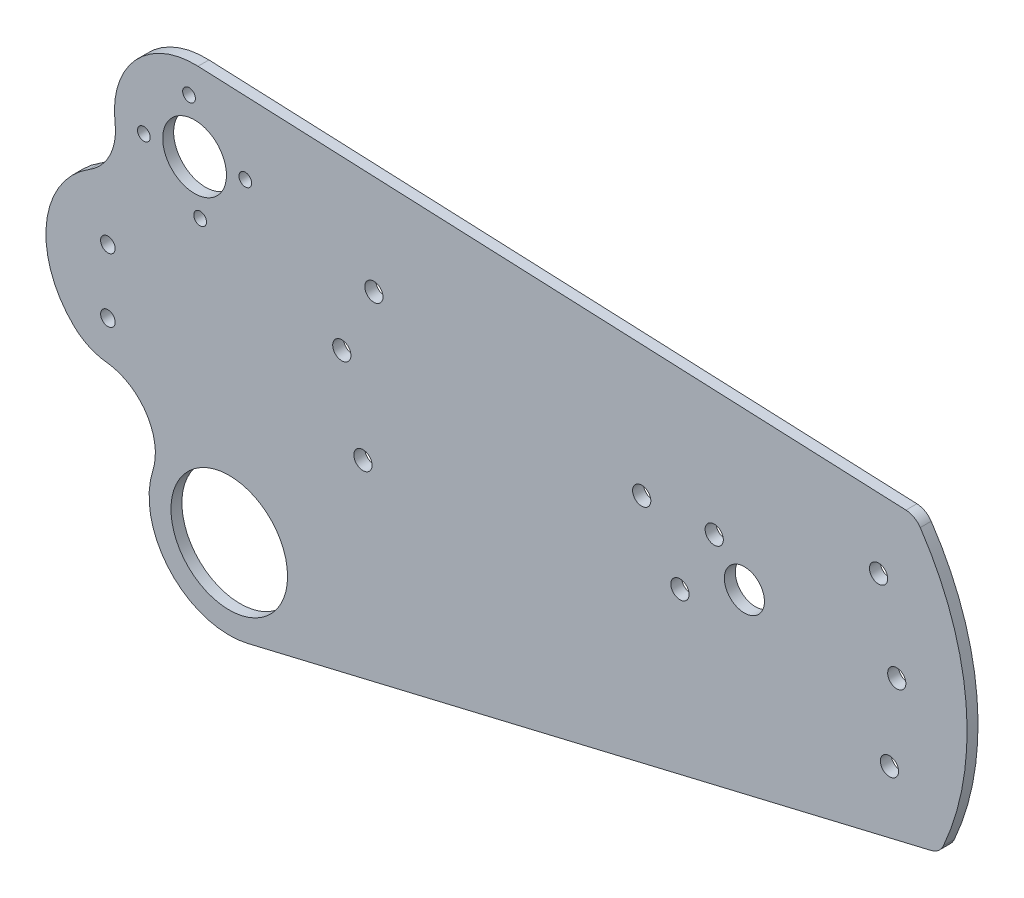
ISO-10303-21;
HEADER;
FILE_DESCRIPTION(('STEP AP214'),'2;1');
FILE_NAME('part.step','',(''),(''),'','','');
FILE_SCHEMA(('AUTOMOTIVE_DESIGN { 1 0 10303 214 1 1 1 1 }'));
ENDSEC;
DATA;
#1=APPLICATION_CONTEXT('core data for automotive mechanical design processes');
#2=APPLICATION_PROTOCOL_DEFINITION('international standard','automotive_design',2000,#1);
#3=PRODUCT_CONTEXT('',#1,'mechanical');
#4=PRODUCT('Part','Part','',(#3));
#5=PRODUCT_RELATED_PRODUCT_CATEGORY('part','',(#4));
#6=PRODUCT_DEFINITION_FORMATION('','',#4);
#7=PRODUCT_DEFINITION_CONTEXT('part definition',#1,'design');
#8=PRODUCT_DEFINITION('design','',#6,#7);
#9=PRODUCT_DEFINITION_SHAPE('','',#8);
#10=(LENGTH_UNIT() NAMED_UNIT(*) SI_UNIT(.MILLI.,.METRE.));
#11=(NAMED_UNIT(*) PLANE_ANGLE_UNIT() SI_UNIT($,.RADIAN.));
#12=(NAMED_UNIT(*) SI_UNIT($,.STERADIAN.) SOLID_ANGLE_UNIT());
#13=UNCERTAINTY_MEASURE_WITH_UNIT(LENGTH_MEASURE(1.E-05),#10,'distance_accuracy_value','');
#14=(GEOMETRIC_REPRESENTATION_CONTEXT(3) GLOBAL_UNCERTAINTY_ASSIGNED_CONTEXT((#13)) GLOBAL_UNIT_ASSIGNED_CONTEXT((#10,
#11,#12)) REPRESENTATION_CONTEXT('',''));
#15=CARTESIAN_POINT('',(0.,0.,0.));
#16=DIRECTION('',(0.,0.,1.));
#17=DIRECTION('',(1.,0.,0.));
#18=AXIS2_PLACEMENT_3D('',#15,#16,#17);
#19=CARTESIAN_POINT('',(1.91215632842237,44.5201547339827,3.));
#20=DIRECTION('',(0.0429107910239942,0.999078907801428,0.));
#21=DIRECTION('',(-0.999078907801428,0.0429107910239942,0.));
#22=AXIS2_PLACEMENT_3D('',#19,#20,#21);
#23=PLANE('',#22);
#24=DIRECTION('',(0.999078907801428,-0.0429107910239942,0.));
#25=VECTOR('',#24,1.);
#26=CARTESIAN_POINT('',(1.91215632842237,44.5201547339827,0.));
#27=LINE('',#26,#25);
#28=CARTESIAN_POINT('',(-113.560266524185,49.4797359716314,0.));
#29=VERTEX_POINT('',#28);
#30=CARTESIAN_POINT('',(80.7215881233943,41.1352618771054,0.));
#31=VERTEX_POINT('',#30);
#32=EDGE_CURVE('E176',#29,#31,#27,.T.);
#33=ORIENTED_EDGE('',*,*,#32,.F.);
#34=DIRECTION('',(0.,0.,-1.));
#35=VECTOR('',#34,1.);
#36=CARTESIAN_POINT('',(-113.560266524185,49.4797359716314,3.));
#37=LINE('',#36,#35);
#38=CARTESIAN_POINT('',(-113.560266524185,49.4797359716314,3.));
#39=VERTEX_POINT('',#38);
#40=EDGE_CURVE('E11',#39,#29,#37,.T.);
#41=ORIENTED_EDGE('',*,*,#40,.F.);
#42=DIRECTION('',(0.999078907801428,-0.0429107910239942,0.));
#43=VECTOR('',#42,1.);
#44=CARTESIAN_POINT('',(1.91215632842237,44.5201547339827,3.));
#45=LINE('',#44,#43);
#46=CARTESIAN_POINT('',(80.7215881233943,41.1352618771054,3.));
#47=VERTEX_POINT('',#46);
#48=EDGE_CURVE('E380',#39,#47,#45,.T.);
#49=ORIENTED_EDGE('',*,*,#48,.T.);
#50=DIRECTION('',(0.,0.,-1.));
#51=VECTOR('',#50,1.);
#52=CARTESIAN_POINT('',(80.7215881233943,41.1352618771054,3.));
#53=LINE('',#52,#51);
#54=EDGE_CURVE('E95',#47,#31,#53,.T.);
#55=ORIENTED_EDGE('',*,*,#54,.T.);
#56=EDGE_LOOP('',(#33,#41,#49,#55));
#57=FACE_BOUND('',#56,.T.);
#58=ADVANCED_FACE('F35',(#57),#23,.T.);
#59=CARTESIAN_POINT('',(-114.504303926713,27.5,3.));
#60=DIRECTION('',(0.,0.,-1.));
#61=DIRECTION('',(-1.,0.,0.));
#62=AXIS2_PLACEMENT_3D('',#59,#60,#61);
#63=CYLINDRICAL_SURFACE('',#62,22.);
#64=CARTESIAN_POINT('',(-114.504303926713,27.5,0.));
#65=DIRECTION('',(0.,0.,1.));
#66=DIRECTION('',(1.,0.,0.));
#67=AXIS2_PLACEMENT_3D('',#64,#65,#66);
#68=CIRCLE('',#67,22.);
#69=CARTESIAN_POINT('',(-136.329525130672,24.732380192604,0.));
#70=VERTEX_POINT('',#69);
#71=EDGE_CURVE('E174',#29,#70,#68,.T.);
#72=ORIENTED_EDGE('',*,*,#71,.T.);
#73=DIRECTION('',(0.,0.,-1.));
#74=VECTOR('',#73,1.);
#75=CARTESIAN_POINT('',(-136.329525130672,24.732380192604,3.));
#76=LINE('',#75,#74);
#77=CARTESIAN_POINT('',(-136.329525130672,24.732380192604,3.));
#78=VERTEX_POINT('',#77);
#79=EDGE_CURVE('E44',#78,#70,#76,.T.);
#80=ORIENTED_EDGE('',*,*,#79,.F.);
#81=CARTESIAN_POINT('',(-114.504303926713,27.5,3.));
#82=DIRECTION('',(0.,0.,1.));
#83=DIRECTION('',(1.,0.,0.));
#84=AXIS2_PLACEMENT_3D('',#81,#82,#83);
#85=CIRCLE('',#84,22.);
#86=EDGE_CURVE('E382',#39,#78,#85,.T.);
#87=ORIENTED_EDGE('',*,*,#86,.F.);
#88=ORIENTED_EDGE('',*,*,#40,.T.);
#89=EDGE_LOOP('',(#72,#80,#87,#88));
#90=FACE_BOUND('',#89,.T.);
#91=ADVANCED_FACE('F175',(#90),#63,.T.);
#92=CARTESIAN_POINT('',(-151.210357769734,22.8453666875613,3.));
#93=DIRECTION('',(0.,0.,-1.));
#94=DIRECTION('',(-1.,0.,0.));
#95=AXIS2_PLACEMENT_3D('',#92,#93,#94);
#96=CYLINDRICAL_SURFACE('',#95,15.);
#97=CARTESIAN_POINT('',(-151.210357769734,22.8453666875613,0.));
#98=DIRECTION('',(0.,0.,1.));
#99=DIRECTION('',(1.,0.,0.));
#100=AXIS2_PLACEMENT_3D('',#97,#98,#99);
#101=CIRCLE('',#100,15.);
#102=CARTESIAN_POINT('',(-143.370984404331,10.0569256082972,0.));
#103=VERTEX_POINT('',#102);
#104=EDGE_CURVE('E169',#103,#70,#101,.T.);
#105=ORIENTED_EDGE('',*,*,#104,.F.);
#106=DIRECTION('',(0.,0.,-1.));
#107=VECTOR('',#106,1.);
#108=CARTESIAN_POINT('',(-143.370984404331,10.0569256082972,3.));
#109=LINE('',#108,#107);
#110=CARTESIAN_POINT('',(-143.370984404331,10.0569256082972,3.));
#111=VERTEX_POINT('',#110);
#112=EDGE_CURVE('E161',#111,#103,#109,.T.);
#113=ORIENTED_EDGE('',*,*,#112,.F.);
#114=CARTESIAN_POINT('',(-151.210357769734,22.8453666875613,3.));
#115=DIRECTION('',(0.,0.,1.));
#116=DIRECTION('',(1.,0.,0.));
#117=AXIS2_PLACEMENT_3D('',#114,#115,#116);
#118=CIRCLE('',#117,15.);
#119=EDGE_CURVE('E171',#111,#78,#118,.T.);
#120=ORIENTED_EDGE('',*,*,#119,.T.);
#121=ORIENTED_EDGE('',*,*,#79,.T.);
#122=EDGE_LOOP('',(#105,#113,#120,#121));
#123=FACE_BOUND('',#122,.T.);
#124=ADVANCED_FACE('F167',(#123),#96,.F.);
#125=CARTESIAN_POINT('',(-130.305362128659,-11.2571428571429,3.));
#126=DIRECTION('',(0.,0.,-1.));
#127=DIRECTION('',(-1.,0.,0.));
#128=AXIS2_PLACEMENT_3D('',#125,#126,#127);
#129=CYLINDRICAL_SURFACE('',#128,25.);
#130=CARTESIAN_POINT('',(-130.305362128659,-11.2571428571429,0.));
#131=DIRECTION('',(0.,0.,1.));
#132=DIRECTION('',(1.,0.,0.));
#133=AXIS2_PLACEMENT_3D('',#130,#131,#132);
#134=CIRCLE('',#133,25.);
#135=CARTESIAN_POINT('',(-147.542861296201,-29.3642857142857,0.));
#136=VERTEX_POINT('',#135);
#137=EDGE_CURVE('E182',#103,#136,#134,.T.);
#138=ORIENTED_EDGE('',*,*,#137,.T.);
#139=DIRECTION('',(0.,0.,-1.));
#140=VECTOR('',#139,1.);
#141=CARTESIAN_POINT('',(-147.542861296201,-29.3642857142857,3.));
#142=LINE('',#141,#140);
#143=CARTESIAN_POINT('',(-147.542861296201,-29.3642857142857,3.));
#144=VERTEX_POINT('',#143);
#145=EDGE_CURVE('E158',#144,#136,#142,.T.);
#146=ORIENTED_EDGE('',*,*,#145,.F.);
#147=CARTESIAN_POINT('',(-130.305362128659,-11.2571428571429,3.));
#148=DIRECTION('',(0.,0.,1.));
#149=DIRECTION('',(1.,0.,0.));
#150=AXIS2_PLACEMENT_3D('',#147,#148,#149);
#151=CIRCLE('',#150,25.);
#152=EDGE_CURVE('E387',#111,#144,#151,.T.);
#153=ORIENTED_EDGE('',*,*,#152,.F.);
#154=ORIENTED_EDGE('',*,*,#112,.T.);
#155=EDGE_LOOP('',(#138,#146,#153,#154));
#156=FACE_BOUND('',#155,.T.);
#157=ADVANCED_FACE('F275',(#156),#129,.T.);
#158=CARTESIAN_POINT('',(-137.200361795676,-18.5,3.));
#159=DIRECTION('',(0.,0.,-1.));
#160=DIRECTION('',(-1.,0.,0.));
#161=AXIS2_PLACEMENT_3D('',#158,#159,#160);
#162=CYLINDRICAL_SURFACE('',#161,15.);
#163=CARTESIAN_POINT('',(-137.200361795676,-18.5,0.));
#164=DIRECTION('',(0.,0.,1.));
#165=DIRECTION('',(1.,0.,0.));
#166=AXIS2_PLACEMENT_3D('',#163,#164,#165);
#167=CIRCLE('',#166,15.);
#168=CARTESIAN_POINT('',(-138.735140925498,-33.4212751808505,0.));
#169=VERTEX_POINT('',#168);
#170=EDGE_CURVE('E184',#136,#169,#167,.T.);
#171=ORIENTED_EDGE('',*,*,#170,.T.);
#172=DIRECTION('',(0.,0.,-1.));
#173=VECTOR('',#172,1.);
#174=CARTESIAN_POINT('',(-138.735140925498,-33.4212751808505,3.));
#175=LINE('',#174,#173);
#176=CARTESIAN_POINT('',(-138.735140925498,-33.4212751808505,3.));
#177=VERTEX_POINT('',#176);
#178=EDGE_CURVE('E156',#177,#169,#175,.T.);
#179=ORIENTED_EDGE('',*,*,#178,.F.);
#180=CARTESIAN_POINT('',(-137.200361795676,-18.5,3.));
#181=DIRECTION('',(0.,0.,1.));
#182=DIRECTION('',(1.,0.,0.));
#183=AXIS2_PLACEMENT_3D('',#180,#181,#182);
#184=CIRCLE('',#183,15.);
#185=EDGE_CURVE('E390',#144,#177,#184,.T.);
#186=ORIENTED_EDGE('',*,*,#185,.F.);
#187=ORIENTED_EDGE('',*,*,#145,.T.);
#188=EDGE_LOOP('',(#171,#179,#186,#187));
#189=FACE_BOUND('',#188,.T.);
#190=ADVANCED_FACE('F278',(#189),#162,.T.);
#191=CARTESIAN_POINT('',(-140.26992005532,-48.3425503617009,3.));
#192=DIRECTION('',(0.,0.,-1.));
#193=DIRECTION('',(-1.,0.,0.));
#194=AXIS2_PLACEMENT_3D('',#191,#192,#193);
#195=CYLINDRICAL_SURFACE('',#194,15.);
#196=CARTESIAN_POINT('',(-140.26992005532,-48.3425503617009,0.));
#197=DIRECTION('',(0.,0.,1.));
#198=DIRECTION('',(1.,0.,0.));
#199=AXIS2_PLACEMENT_3D('',#196,#197,#198);
#200=CIRCLE('',#199,15.);
#201=CARTESIAN_POINT('',(-125.965715233565,-52.8580486085475,0.));
#202=VERTEX_POINT('',#201);
#203=EDGE_CURVE('E190',#202,#169,#200,.T.);
#204=ORIENTED_EDGE('',*,*,#203,.F.);
#205=DIRECTION('',(0.,0.,-1.));
#206=VECTOR('',#205,1.);
#207=CARTESIAN_POINT('',(-125.965715233565,-52.8580486085475,3.));
#208=LINE('',#207,#206);
#209=CARTESIAN_POINT('',(-125.965715233565,-52.8580486085475,3.));
#210=VERTEX_POINT('',#209);
#211=EDGE_CURVE('E154',#210,#202,#208,.T.);
#212=ORIENTED_EDGE('',*,*,#211,.F.);
#213=CARTESIAN_POINT('',(-140.26992005532,-48.3425503617009,3.));
#214=DIRECTION('',(0.,0.,1.));
#215=DIRECTION('',(1.,0.,0.));
#216=AXIS2_PLACEMENT_3D('',#213,#214,#215);
#217=CIRCLE('',#216,15.);
#218=EDGE_CURVE('E392',#210,#177,#217,.T.);
#219=ORIENTED_EDGE('',*,*,#218,.T.);
#220=ORIENTED_EDGE('',*,*,#178,.T.);
#221=EDGE_LOOP('',(#204,#212,#219,#220));
#222=FACE_BOUND('',#221,.T.);
#223=ADVANCED_FACE('F282',(#222),#195,.F.);
#224=CARTESIAN_POINT('',(-104.986214828324,-59.4807793705892,3.));
#225=DIRECTION('',(0.,0.,-1.));
#226=DIRECTION('',(-1.,0.,0.));
#227=AXIS2_PLACEMENT_3D('',#224,#225,#226);
#228=CYLINDRICAL_SURFACE('',#227,22.);
#229=CARTESIAN_POINT('',(-104.986214828324,-59.4807793705892,0.));
#230=DIRECTION('',(0.,0.,1.));
#231=DIRECTION('',(1.,0.,0.));
#232=AXIS2_PLACEMENT_3D('',#229,#230,#231);
#233=CIRCLE('',#232,22.);
#234=CARTESIAN_POINT('',(-99.8994420943231,-80.8846281635664,0.));
#235=VERTEX_POINT('',#234);
#236=EDGE_CURVE('E193',#202,#235,#233,.T.);
#237=ORIENTED_EDGE('',*,*,#236,.T.);
#238=DIRECTION('',(0.,0.,-1.));
#239=VECTOR('',#238,1.);
#240=CARTESIAN_POINT('',(-99.8994420943231,-80.8846281635664,3.));
#241=LINE('',#240,#239);
#242=CARTESIAN_POINT('',(-99.8994420943231,-80.8846281635664,3.));
#243=VERTEX_POINT('',#242);
#244=EDGE_CURVE('E147',#243,#235,#241,.T.);
#245=ORIENTED_EDGE('',*,*,#244,.F.);
#246=CARTESIAN_POINT('',(-104.986214828324,-59.4807793705892,3.));
#247=DIRECTION('',(0.,0.,1.));
#248=DIRECTION('',(1.,0.,0.));
#249=AXIS2_PLACEMENT_3D('',#246,#247,#248);
#250=CIRCLE('',#249,22.);
#251=EDGE_CURVE('E395',#210,#243,#250,.T.);
#252=ORIENTED_EDGE('',*,*,#251,.F.);
#253=ORIENTED_EDGE('',*,*,#211,.T.);
#254=EDGE_LOOP('',(#237,#245,#252,#253));
#255=FACE_BOUND('',#254,.T.);
#256=ADVANCED_FACE('F286',(#255),#228,.T.);
#257=CARTESIAN_POINT('',(12.8543650069219,-54.0879058934321,3.));
#258=DIRECTION('',(-0.231216942454566,0.972902217862598,0.));
#259=DIRECTION('',(-0.972902217862598,-0.231216942454566,0.));
#260=AXIS2_PLACEMENT_3D('',#257,#258,#259);
#261=PLANE('',#260);
#262=DIRECTION('',(0.972902217862598,0.231216942454566,0.));
#263=VECTOR('',#262,1.);
#264=CARTESIAN_POINT('',(12.8543650069219,-54.0879058934321,0.));
#265=LINE('',#264,#263);
#266=CARTESIAN_POINT('',(87.5903381718725,-36.3263848594582,0.));
#267=VERTEX_POINT('',#266);
#268=EDGE_CURVE('E196',#235,#267,#265,.T.);
#269=ORIENTED_EDGE('',*,*,#268,.T.);
#270=DIRECTION('',(0.,0.,-1.));
#271=VECTOR('',#270,1.);
#272=CARTESIAN_POINT('',(87.5903381718725,-36.3263848594582,3.));
#273=LINE('',#272,#271);
#274=CARTESIAN_POINT('',(87.5903381718725,-36.3263848594582,3.));
#275=VERTEX_POINT('',#274);
#276=EDGE_CURVE('E145',#275,#267,#273,.T.);
#277=ORIENTED_EDGE('',*,*,#276,.F.);
#278=DIRECTION('',(0.972902217862598,0.231216942454566,0.));
#279=VECTOR('',#278,1.);
#280=CARTESIAN_POINT('',(12.8543650069219,-54.0879058934321,3.));
#281=LINE('',#280,#279);
#282=EDGE_CURVE('E138',#243,#275,#281,.T.);
#283=ORIENTED_EDGE('',*,*,#282,.F.);
#284=ORIENTED_EDGE('',*,*,#244,.T.);
#285=EDGE_LOOP('',(#269,#277,#283,#284));
#286=FACE_BOUND('',#285,.T.);
#287=ADVANCED_FACE('F290',(#286),#261,.F.);
#288=CARTESIAN_POINT('',(86.4342534595996,-31.4618737701452,3.));
#289=DIRECTION('',(0.,0.,-1.));
#290=DIRECTION('',(-1.,0.,0.));
#291=AXIS2_PLACEMENT_3D('',#288,#289,#290);
#292=CYLINDRICAL_SURFACE('',#291,5.00000000000001);
#293=CARTESIAN_POINT('',(86.4342534595996,-31.4618737701452,0.));
#294=DIRECTION('',(0.,0.,1.));
#295=DIRECTION('',(1.,0.,0.));
#296=AXIS2_PLACEMENT_3D('',#293,#294,#295);
#297=CIRCLE('',#296,5.00000000000001);
#298=CARTESIAN_POINT('',(91.,-33.5,0.));
#299=VERTEX_POINT('',#298);
#300=EDGE_CURVE('E144',#267,#299,#297,.T.);
#301=ORIENTED_EDGE('',*,*,#300,.T.);
#302=DIRECTION('',(0.,0.,-1.));
#303=VECTOR('',#302,1.);
#304=CARTESIAN_POINT('',(91.,-33.5,3.));
#305=LINE('',#304,#303);
#306=CARTESIAN_POINT('',(91.,-33.5,3.));
#307=VERTEX_POINT('',#306);
#308=EDGE_CURVE('E129',#307,#299,#305,.T.);
#309=ORIENTED_EDGE('',*,*,#308,.F.);
#310=CARTESIAN_POINT('',(86.4342534595996,-31.4618737701452,3.));
#311=DIRECTION('',(0.,0.,1.));
#312=DIRECTION('',(1.,0.,0.));
#313=AXIS2_PLACEMENT_3D('',#310,#311,#312);
#314=CIRCLE('',#313,5.00000000000001);
#315=EDGE_CURVE('E132',#275,#307,#314,.T.);
#316=ORIENTED_EDGE('',*,*,#315,.F.);
#317=ORIENTED_EDGE('',*,*,#276,.T.);
#318=EDGE_LOOP('',(#301,#309,#316,#317));
#319=FACE_BOUND('',#318,.T.);
#320=ADVANCED_FACE('F143',(#319),#292,.T.);
#321=CARTESIAN_POINT('',(22.6589151875398,-2.99288439458776,3.));
#322=DIRECTION('',(0.,0.,-1.));
#323=DIRECTION('',(-1.,0.,0.));
#324=AXIS2_PLACEMENT_3D('',#321,#322,#323);
#325=CYLINDRICAL_SURFACE('',#324,74.8410848124603);
#326=CARTESIAN_POINT('',(22.6589151875398,-2.99288439458776,0.));
#327=DIRECTION('',(0.,0.,1.));
#328=DIRECTION('',(1.,0.,0.));
#329=AXIS2_PLACEMENT_3D('',#326,#327,#328);
#330=CIRCLE('',#329,74.8410848124603);
#331=CARTESIAN_POINT('',(84.648444567044,38.9414240319674,0.));
#332=VERTEX_POINT('',#331);
#333=EDGE_CURVE('E200',#299,#332,#330,.T.);
#334=ORIENTED_EDGE('',*,*,#333,.T.);
#335=DIRECTION('',(0.,0.,-1.));
#336=VECTOR('',#335,1.);
#337=CARTESIAN_POINT('',(84.648444567044,38.9414240319674,3.));
#338=LINE('',#337,#336);
#339=CARTESIAN_POINT('',(84.648444567044,38.9414240319674,3.));
#340=VERTEX_POINT('',#339);
#341=EDGE_CURVE('E131',#340,#332,#338,.T.);
#342=ORIENTED_EDGE('',*,*,#341,.F.);
#343=CARTESIAN_POINT('',(22.6589151875398,-2.99288439458776,3.));
#344=DIRECTION('',(0.,0.,1.));
#345=DIRECTION('',(1.,0.,0.));
#346=AXIS2_PLACEMENT_3D('',#343,#344,#345);
#347=CIRCLE('',#346,74.8410848124603);
#348=EDGE_CURVE('E124',#307,#340,#347,.T.);
#349=ORIENTED_EDGE('',*,*,#348,.F.);
#350=ORIENTED_EDGE('',*,*,#308,.T.);
#351=EDGE_LOOP('',(#334,#342,#349,#350));
#352=FACE_BOUND('',#351,.T.);
#353=ADVANCED_FACE('F127',(#352),#325,.T.);
#354=CARTESIAN_POINT('',(-100.587379227419,29.0228942557423,3.));
#355=DIRECTION('',(0.,0.,-1.));
#356=DIRECTION('',(-1.,0.,0.));
#357=AXIS2_PLACEMENT_3D('',#354,#355,#356);
#358=CYLINDRICAL_SURFACE('',#357,1.74999999999997);
#359=CARTESIAN_POINT('',(-100.587379227419,29.0228942557423,3.));
#360=DIRECTION('',(0.,0.,1.));
#361=DIRECTION('',(1.,0.,0.));
#362=AXIS2_PLACEMENT_3D('',#359,#360,#361);
#363=CIRCLE('',#362,1.74999999999997);
#364=CARTESIAN_POINT('',(-98.8373792274191,29.0228942557423,3.));
#365=VERTEX_POINT('',#364);
#366=EDGE_CURVE('E256',#365,#365,#363,.T.);
#367=ORIENTED_EDGE('',*,*,#366,.T.);
#368=EDGE_LOOP('',(#367));
#369=FACE_BOUND('',#368,.T.);
#370=CARTESIAN_POINT('',(-100.587379227419,29.0228942557423,0.));
#371=DIRECTION('',(0.,0.,1.));
#372=DIRECTION('',(1.,0.,0.));
#373=AXIS2_PLACEMENT_3D('',#370,#371,#372);
#374=CIRCLE('',#373,1.74999999999997);
#375=CARTESIAN_POINT('',(-98.8373792274191,29.0228942557423,0.));
#376=VERTEX_POINT('',#375);
#377=EDGE_CURVE('E248',#376,#376,#374,.T.);
#378=ORIENTED_EDGE('',*,*,#377,.F.);
#379=EDGE_LOOP('',(#378));
#380=FACE_BOUND('',#379,.T.);
#381=ADVANCED_FACE('F299',(#369,#380),#358,.F.);
#382=CARTESIAN_POINT('',(-112.981409670971,13.5830753007057,3.));
#383=DIRECTION('',(0.,0.,-1.));
#384=DIRECTION('',(-1.,0.,0.));
#385=AXIS2_PLACEMENT_3D('',#382,#383,#384);
#386=CYLINDRICAL_SURFACE('',#385,1.74999999999997);
#387=CARTESIAN_POINT('',(-112.981409670971,13.5830753007057,3.));
#388=DIRECTION('',(0.,0.,1.));
#389=DIRECTION('',(1.,0.,0.));
#390=AXIS2_PLACEMENT_3D('',#387,#388,#389);
#391=CIRCLE('',#390,1.74999999999997);
#392=CARTESIAN_POINT('',(-111.231409670971,13.5830753007057,3.));
#393=VERTEX_POINT('',#392);
#394=EDGE_CURVE('E261',#393,#393,#391,.T.);
#395=ORIENTED_EDGE('',*,*,#394,.T.);
#396=EDGE_LOOP('',(#395));
#397=FACE_BOUND('',#396,.T.);
#398=CARTESIAN_POINT('',(-112.981409670971,13.5830753007057,0.));
#399=DIRECTION('',(0.,0.,1.));
#400=DIRECTION('',(1.,0.,0.));
#401=AXIS2_PLACEMENT_3D('',#398,#399,#400);
#402=CIRCLE('',#401,1.74999999999997);
#403=CARTESIAN_POINT('',(-111.231409670971,13.5830753007057,0.));
#404=VERTEX_POINT('',#403);
#405=EDGE_CURVE('E245',#404,#404,#402,.T.);
#406=ORIENTED_EDGE('',*,*,#405,.F.);
#407=EDGE_LOOP('',(#406));
#408=FACE_BOUND('',#407,.T.);
#409=ADVANCED_FACE('F359',(#397,#408),#386,.F.);
#410=CARTESIAN_POINT('',(-128.421228626008,25.9771057442576,3.));
#411=DIRECTION('',(0.,0.,-1.));
#412=DIRECTION('',(-1.,0.,0.));
#413=AXIS2_PLACEMENT_3D('',#410,#411,#412);
#414=CYLINDRICAL_SURFACE('',#413,1.74999999999998);
#415=CARTESIAN_POINT('',(-128.421228626008,25.9771057442576,3.));
#416=DIRECTION('',(0.,0.,1.));
#417=DIRECTION('',(1.,0.,0.));
#418=AXIS2_PLACEMENT_3D('',#415,#416,#417);
#419=CIRCLE('',#418,1.74999999999998);
#420=CARTESIAN_POINT('',(-126.671228626008,25.9771057442576,3.));
#421=VERTEX_POINT('',#420);
#422=EDGE_CURVE('E438',#421,#421,#419,.T.);
#423=ORIENTED_EDGE('',*,*,#422,.T.);
#424=EDGE_LOOP('',(#423));
#425=FACE_BOUND('',#424,.T.);
#426=CARTESIAN_POINT('',(-128.421228626008,25.9771057442576,0.));
#427=DIRECTION('',(0.,0.,1.));
#428=DIRECTION('',(1.,0.,0.));
#429=AXIS2_PLACEMENT_3D('',#426,#427,#428);
#430=CIRCLE('',#429,1.74999999999998);
#431=CARTESIAN_POINT('',(-126.671228626008,25.9771057442576,0.));
#432=VERTEX_POINT('',#431);
#433=EDGE_CURVE('E242',#432,#432,#430,.T.);
#434=ORIENTED_EDGE('',*,*,#433,.F.);
#435=EDGE_LOOP('',(#434));
#436=FACE_BOUND('',#435,.T.);
#437=ADVANCED_FACE('F355',(#425,#436),#414,.F.);
#438=CARTESIAN_POINT('',(-114.504303926713,27.5,3.));
#439=DIRECTION('',(0.,0.,-1.));
#440=DIRECTION('',(-1.,0.,0.));
#441=AXIS2_PLACEMENT_3D('',#438,#439,#440);
#442=CYLINDRICAL_SURFACE('',#441,8.75);
#443=CARTESIAN_POINT('',(-114.504303926713,27.5,3.));
#444=DIRECTION('',(0.,0.,1.));
#445=DIRECTION('',(1.,0.,0.));
#446=AXIS2_PLACEMENT_3D('',#443,#444,#445);
#447=CIRCLE('',#446,8.75);
#448=CARTESIAN_POINT('',(-105.754303926713,27.5,3.));
#449=VERTEX_POINT('',#448);
#450=EDGE_CURVE('E435',#449,#449,#447,.T.);
#451=ORIENTED_EDGE('',*,*,#450,.T.);
#452=EDGE_LOOP('',(#451));
#453=FACE_BOUND('',#452,.T.);
#454=CARTESIAN_POINT('',(-114.504303926713,27.5,0.));
#455=DIRECTION('',(0.,0.,1.));
#456=DIRECTION('',(1.,0.,0.));
#457=AXIS2_PLACEMENT_3D('',#454,#455,#456);
#458=CIRCLE('',#457,8.75);
#459=CARTESIAN_POINT('',(-105.754303926713,27.5,0.));
#460=VERTEX_POINT('',#459);
#461=EDGE_CURVE('E239',#460,#460,#458,.T.);
#462=ORIENTED_EDGE('',*,*,#461,.F.);
#463=EDGE_LOOP('',(#462));
#464=FACE_BOUND('',#463,.T.);
#465=ADVANCED_FACE('F351',(#453,#464),#442,.F.);
#466=CARTESIAN_POINT('',(-104.986214828324,-59.4807793705892,3.));
#467=DIRECTION('',(0.,0.,-1.));
#468=DIRECTION('',(-1.,0.,0.));
#469=AXIS2_PLACEMENT_3D('',#466,#467,#468);
#470=CYLINDRICAL_SURFACE('',#469,16.);
#471=CARTESIAN_POINT('',(-104.986214828324,-59.4807793705892,3.));
#472=DIRECTION('',(0.,0.,1.));
#473=DIRECTION('',(1.,0.,0.));
#474=AXIS2_PLACEMENT_3D('',#471,#472,#473);
#475=CIRCLE('',#474,16.);
#476=CARTESIAN_POINT('',(-88.9862148283235,-59.4807793705892,3.));
#477=VERTEX_POINT('',#476);
#478=EDGE_CURVE('E432',#477,#477,#475,.T.);
#479=ORIENTED_EDGE('',*,*,#478,.T.);
#480=EDGE_LOOP('',(#479));
#481=FACE_BOUND('',#480,.T.);
#482=CARTESIAN_POINT('',(-104.986214828324,-59.4807793705892,0.));
#483=DIRECTION('',(0.,0.,1.));
#484=DIRECTION('',(1.,0.,0.));
#485=AXIS2_PLACEMENT_3D('',#482,#483,#484);
#486=CIRCLE('',#485,16.);
#487=CARTESIAN_POINT('',(-88.9862148283235,-59.4807793705892,0.));
#488=VERTEX_POINT('',#487);
#489=EDGE_CURVE('E236',#488,#488,#486,.T.);
#490=ORIENTED_EDGE('',*,*,#489,.F.);
#491=EDGE_LOOP('',(#490));
#492=FACE_BOUND('',#491,.T.);
#493=ADVANCED_FACE('F347',(#481,#492),#470,.F.);
#494=CARTESIAN_POINT('',(-68.3,-21.5,3.));
#495=DIRECTION('',(0.,0.,-1.));
#496=DIRECTION('',(-1.,0.,0.));
#497=AXIS2_PLACEMENT_3D('',#494,#495,#496);
#498=CYLINDRICAL_SURFACE('',#497,2.49999999999999);
#499=CARTESIAN_POINT('',(-68.3,-21.5,3.));
#500=DIRECTION('',(0.,0.,1.));
#501=DIRECTION('',(1.,0.,0.));
#502=AXIS2_PLACEMENT_3D('',#499,#500,#501);
#503=CIRCLE('',#502,2.49999999999999);
#504=CARTESIAN_POINT('',(-65.8,-21.5,3.));
#505=VERTEX_POINT('',#504);
#506=EDGE_CURVE('E429',#505,#505,#503,.T.);
#507=ORIENTED_EDGE('',*,*,#506,.T.);
#508=EDGE_LOOP('',(#507));
#509=FACE_BOUND('',#508,.T.);
#510=CARTESIAN_POINT('',(-68.3,-21.5,0.));
#511=DIRECTION('',(0.,0.,1.));
#512=DIRECTION('',(1.,0.,0.));
#513=AXIS2_PLACEMENT_3D('',#510,#511,#512);
#514=CIRCLE('',#513,2.49999999999999);
#515=CARTESIAN_POINT('',(-65.8,-21.5,0.));
#516=VERTEX_POINT('',#515);
#517=EDGE_CURVE('E233',#516,#516,#514,.T.);
#518=ORIENTED_EDGE('',*,*,#517,.F.);
#519=EDGE_LOOP('',(#518));
#520=FACE_BOUND('',#519,.T.);
#521=ADVANCED_FACE('F343',(#509,#520),#498,.F.);
#522=CARTESIAN_POINT('',(-138.3,-5.25000000000004,3.));
#523=DIRECTION('',(0.,0.,-1.));
#524=DIRECTION('',(-1.,0.,0.));
#525=AXIS2_PLACEMENT_3D('',#522,#523,#524);
#526=CYLINDRICAL_SURFACE('',#525,2.);
#527=CARTESIAN_POINT('',(-138.3,-5.25000000000004,3.));
#528=DIRECTION('',(0.,0.,1.));
#529=DIRECTION('',(1.,0.,0.));
#530=AXIS2_PLACEMENT_3D('',#527,#528,#529);
#531=CIRCLE('',#530,2.);
#532=CARTESIAN_POINT('',(-136.3,-5.25000000000004,3.));
#533=VERTEX_POINT('',#532);
#534=EDGE_CURVE('E426',#533,#533,#531,.T.);
#535=ORIENTED_EDGE('',*,*,#534,.T.);
#536=EDGE_LOOP('',(#535));
#537=FACE_BOUND('',#536,.T.);
#538=CARTESIAN_POINT('',(-138.3,-5.25000000000004,0.));
#539=DIRECTION('',(0.,0.,1.));
#540=DIRECTION('',(1.,0.,0.));
#541=AXIS2_PLACEMENT_3D('',#538,#539,#540);
#542=CIRCLE('',#541,2.);
#543=CARTESIAN_POINT('',(-136.3,-5.25000000000004,0.));
#544=VERTEX_POINT('',#543);
#545=EDGE_CURVE('E230',#544,#544,#542,.T.);
#546=ORIENTED_EDGE('',*,*,#545,.F.);
#547=EDGE_LOOP('',(#546));
#548=FACE_BOUND('',#547,.T.);
#549=ADVANCED_FACE('F339',(#537,#548),#526,.F.);
#550=CARTESIAN_POINT('',(-138.3,-22.75,3.));
#551=DIRECTION('',(0.,0.,-1.));
#552=DIRECTION('',(-1.,0.,0.));
#553=AXIS2_PLACEMENT_3D('',#550,#551,#552);
#554=CYLINDRICAL_SURFACE('',#553,2.);
#555=CARTESIAN_POINT('',(-138.3,-22.75,3.));
#556=DIRECTION('',(0.,0.,1.));
#557=DIRECTION('',(1.,0.,0.));
#558=AXIS2_PLACEMENT_3D('',#555,#556,#557);
#559=CIRCLE('',#558,2.);
#560=CARTESIAN_POINT('',(-136.3,-22.75,3.));
#561=VERTEX_POINT('',#560);
#562=EDGE_CURVE('E423',#561,#561,#559,.T.);
#563=ORIENTED_EDGE('',*,*,#562,.T.);
#564=EDGE_LOOP('',(#563));
#565=FACE_BOUND('',#564,.T.);
#566=CARTESIAN_POINT('',(-138.3,-22.75,0.));
#567=DIRECTION('',(0.,0.,1.));
#568=DIRECTION('',(1.,0.,0.));
#569=AXIS2_PLACEMENT_3D('',#566,#567,#568);
#570=CIRCLE('',#569,2.);
#571=CARTESIAN_POINT('',(-136.3,-22.75,0.));
#572=VERTEX_POINT('',#571);
#573=EDGE_CURVE('E227',#572,#572,#570,.T.);
#574=ORIENTED_EDGE('',*,*,#573,.F.);
#575=EDGE_LOOP('',(#574));
#576=FACE_BOUND('',#575,.T.);
#577=ADVANCED_FACE('F335',(#565,#576),#554,.F.);
#578=CARTESIAN_POINT('',(-74.1,1.7,3.));
#579=DIRECTION('',(0.,0.,-1.));
#580=DIRECTION('',(-1.,0.,0.));
#581=AXIS2_PLACEMENT_3D('',#578,#579,#580);
#582=CYLINDRICAL_SURFACE('',#581,2.49999999999999);
#583=CARTESIAN_POINT('',(-74.1,1.7,3.));
#584=DIRECTION('',(0.,0.,1.));
#585=DIRECTION('',(1.,0.,0.));
#586=AXIS2_PLACEMENT_3D('',#583,#584,#585);
#587=CIRCLE('',#586,2.49999999999999);
#588=CARTESIAN_POINT('',(-71.6,1.7,3.));
#589=VERTEX_POINT('',#588);
#590=EDGE_CURVE('E420',#589,#589,#587,.T.);
#591=ORIENTED_EDGE('',*,*,#590,.T.);
#592=EDGE_LOOP('',(#591));
#593=FACE_BOUND('',#592,.T.);
#594=CARTESIAN_POINT('',(-74.1,1.7,0.));
#595=DIRECTION('',(0.,0.,1.));
#596=DIRECTION('',(1.,0.,0.));
#597=AXIS2_PLACEMENT_3D('',#594,#595,#596);
#598=CIRCLE('',#597,2.49999999999999);
#599=CARTESIAN_POINT('',(-71.6,1.7,0.));
#600=VERTEX_POINT('',#599);
#601=EDGE_CURVE('E224',#600,#600,#598,.T.);
#602=ORIENTED_EDGE('',*,*,#601,.F.);
#603=EDGE_LOOP('',(#602));
#604=FACE_BOUND('',#603,.T.);
#605=ADVANCED_FACE('F331',(#593,#604),#582,.F.);
#606=CARTESIAN_POINT('',(-65.3,20.,3.));
#607=DIRECTION('',(0.,0.,-1.));
#608=DIRECTION('',(-1.,0.,0.));
#609=AXIS2_PLACEMENT_3D('',#606,#607,#608);
#610=CYLINDRICAL_SURFACE('',#609,2.50000000000001);
#611=CARTESIAN_POINT('',(-65.3,20.,3.));
#612=DIRECTION('',(0.,0.,1.));
#613=DIRECTION('',(1.,0.,0.));
#614=AXIS2_PLACEMENT_3D('',#611,#612,#613);
#615=CIRCLE('',#614,2.50000000000001);
#616=CARTESIAN_POINT('',(-62.8,20.,3.));
#617=VERTEX_POINT('',#616);
#618=EDGE_CURVE('E417',#617,#617,#615,.T.);
#619=ORIENTED_EDGE('',*,*,#618,.T.);
#620=EDGE_LOOP('',(#619));
#621=FACE_BOUND('',#620,.T.);
#622=CARTESIAN_POINT('',(-65.3,20.,0.));
#623=DIRECTION('',(0.,0.,1.));
#624=DIRECTION('',(1.,0.,0.));
#625=AXIS2_PLACEMENT_3D('',#622,#623,#624);
#626=CIRCLE('',#625,2.50000000000001);
#627=CARTESIAN_POINT('',(-62.8,20.,0.));
#628=VERTEX_POINT('',#627);
#629=EDGE_CURVE('E221',#628,#628,#626,.T.);
#630=ORIENTED_EDGE('',*,*,#629,.F.);
#631=EDGE_LOOP('',(#630));
#632=FACE_BOUND('',#631,.T.);
#633=ADVANCED_FACE('F327',(#621,#632),#610,.F.);
#634=CARTESIAN_POINT('',(78.2,-0.100000000000003,3.));
#635=DIRECTION('',(0.,0.,-1.));
#636=DIRECTION('',(-1.,0.,0.));
#637=AXIS2_PLACEMENT_3D('',#634,#635,#636);
#638=CYLINDRICAL_SURFACE('',#637,2.5);
#639=CARTESIAN_POINT('',(78.2,-0.100000000000003,3.));
#640=DIRECTION('',(0.,0.,1.));
#641=DIRECTION('',(1.,0.,0.));
#642=AXIS2_PLACEMENT_3D('',#639,#640,#641);
#643=CIRCLE('',#642,2.5);
#644=CARTESIAN_POINT('',(80.7,-0.100000000000003,3.));
#645=VERTEX_POINT('',#644);
#646=EDGE_CURVE('E414',#645,#645,#643,.T.);
#647=ORIENTED_EDGE('',*,*,#646,.T.);
#648=EDGE_LOOP('',(#647));
#649=FACE_BOUND('',#648,.T.);
#650=CARTESIAN_POINT('',(78.2,-0.100000000000003,0.));
#651=DIRECTION('',(0.,0.,1.));
#652=DIRECTION('',(1.,0.,0.));
#653=AXIS2_PLACEMENT_3D('',#650,#651,#652);
#654=CIRCLE('',#653,2.5);
#655=CARTESIAN_POINT('',(80.7,-0.100000000000003,0.));
#656=VERTEX_POINT('',#655);
#657=EDGE_CURVE('E218',#656,#656,#654,.T.);
#658=ORIENTED_EDGE('',*,*,#657,.F.);
#659=EDGE_LOOP('',(#658));
#660=FACE_BOUND('',#659,.T.);
#661=ADVANCED_FACE('F323',(#649,#660),#638,.F.);
#662=CARTESIAN_POINT('',(18.7,-8.7,3.));
#663=DIRECTION('',(0.,0.,-1.));
#664=DIRECTION('',(-1.,0.,0.));
#665=AXIS2_PLACEMENT_3D('',#662,#663,#664);
#666=CYLINDRICAL_SURFACE('',#665,2.5);
#667=CARTESIAN_POINT('',(18.7,-8.7,3.));
#668=DIRECTION('',(0.,0.,1.));
#669=DIRECTION('',(1.,0.,0.));
#670=AXIS2_PLACEMENT_3D('',#667,#668,#669);
#671=CIRCLE('',#670,2.5);
#672=CARTESIAN_POINT('',(21.2,-8.7,3.));
#673=VERTEX_POINT('',#672);
#674=EDGE_CURVE('E411',#673,#673,#671,.T.);
#675=ORIENTED_EDGE('',*,*,#674,.T.);
#676=EDGE_LOOP('',(#675));
#677=FACE_BOUND('',#676,.T.);
#678=CARTESIAN_POINT('',(18.7,-8.7,0.));
#679=DIRECTION('',(0.,0.,1.));
#680=DIRECTION('',(1.,0.,0.));
#681=AXIS2_PLACEMENT_3D('',#678,#679,#680);
#682=CIRCLE('',#681,2.5);
#683=CARTESIAN_POINT('',(21.2,-8.7,0.));
#684=VERTEX_POINT('',#683);
#685=EDGE_CURVE('E215',#684,#684,#682,.T.);
#686=ORIENTED_EDGE('',*,*,#685,.F.);
#687=EDGE_LOOP('',(#686));
#688=FACE_BOUND('',#687,.T.);
#689=ADVANCED_FACE('F319',(#677,#688),#666,.F.);
#690=CARTESIAN_POINT('',(28.1,9.,3.));
#691=DIRECTION('',(0.,0.,-1.));
#692=DIRECTION('',(-1.,0.,0.));
#693=AXIS2_PLACEMENT_3D('',#690,#691,#692);
#694=CYLINDRICAL_SURFACE('',#693,2.5);
#695=CARTESIAN_POINT('',(28.1,9.,3.));
#696=DIRECTION('',(0.,0.,1.));
#697=DIRECTION('',(1.,0.,0.));
#698=AXIS2_PLACEMENT_3D('',#695,#696,#697);
#699=CIRCLE('',#698,2.5);
#700=CARTESIAN_POINT('',(30.6,9.,3.));
#701=VERTEX_POINT('',#700);
#702=EDGE_CURVE('E408',#701,#701,#699,.T.);
#703=ORIENTED_EDGE('',*,*,#702,.T.);
#704=EDGE_LOOP('',(#703));
#705=FACE_BOUND('',#704,.T.);
#706=CARTESIAN_POINT('',(28.1,9.,0.));
#707=DIRECTION('',(0.,0.,1.));
#708=DIRECTION('',(1.,0.,0.));
#709=AXIS2_PLACEMENT_3D('',#706,#707,#708);
#710=CIRCLE('',#709,2.5);
#711=CARTESIAN_POINT('',(30.6,9.,0.));
#712=VERTEX_POINT('',#711);
#713=EDGE_CURVE('E212',#712,#712,#710,.T.);
#714=ORIENTED_EDGE('',*,*,#713,.F.);
#715=EDGE_LOOP('',(#714));
#716=FACE_BOUND('',#715,.T.);
#717=ADVANCED_FACE('F315',(#705,#716),#694,.F.);
#718=CARTESIAN_POINT('',(8.20000000000003,8.3,3.));
#719=DIRECTION('',(0.,0.,-1.));
#720=DIRECTION('',(-1.,0.,0.));
#721=AXIS2_PLACEMENT_3D('',#718,#719,#720);
#722=CYLINDRICAL_SURFACE('',#721,2.5);
#723=CARTESIAN_POINT('',(8.20000000000003,8.3,3.));
#724=DIRECTION('',(0.,0.,1.));
#725=DIRECTION('',(1.,0.,0.));
#726=AXIS2_PLACEMENT_3D('',#723,#724,#725);
#727=CIRCLE('',#726,2.5);
#728=CARTESIAN_POINT('',(10.7,8.3,3.));
#729=VERTEX_POINT('',#728);
#730=EDGE_CURVE('E405',#729,#729,#727,.T.);
#731=ORIENTED_EDGE('',*,*,#730,.T.);
#732=EDGE_LOOP('',(#731));
#733=FACE_BOUND('',#732,.T.);
#734=CARTESIAN_POINT('',(8.20000000000003,8.3,0.));
#735=DIRECTION('',(0.,0.,1.));
#736=DIRECTION('',(1.,0.,0.));
#737=AXIS2_PLACEMENT_3D('',#734,#735,#736);
#738=CIRCLE('',#737,2.5);
#739=CARTESIAN_POINT('',(10.7,8.3,0.));
#740=VERTEX_POINT('',#739);
#741=EDGE_CURVE('E209',#740,#740,#738,.T.);
#742=ORIENTED_EDGE('',*,*,#741,.F.);
#743=EDGE_LOOP('',(#742));
#744=FACE_BOUND('',#743,.T.);
#745=ADVANCED_FACE('F311',(#733,#744),#722,.F.);
#746=CARTESIAN_POINT('',(36.3824499650715,0.,3.));
#747=DIRECTION('',(0.,0.,-1.));
#748=DIRECTION('',(-1.,0.,0.));
#749=AXIS2_PLACEMENT_3D('',#746,#747,#748);
#750=CYLINDRICAL_SURFACE('',#749,5.5);
#751=CARTESIAN_POINT('',(36.3824499650715,0.,3.));
#752=DIRECTION('',(0.,0.,1.));
#753=DIRECTION('',(1.,0.,0.));
#754=AXIS2_PLACEMENT_3D('',#751,#752,#753);
#755=CIRCLE('',#754,5.5);
#756=CARTESIAN_POINT('',(41.8824499650715,0.,3.));
#757=VERTEX_POINT('',#756);
#758=EDGE_CURVE('E402',#757,#757,#755,.T.);
#759=ORIENTED_EDGE('',*,*,#758,.T.);
#760=EDGE_LOOP('',(#759));
#761=FACE_BOUND('',#760,.T.);
#762=CARTESIAN_POINT('',(36.3824499650715,0.,0.));
#763=DIRECTION('',(0.,0.,1.));
#764=DIRECTION('',(1.,0.,0.));
#765=AXIS2_PLACEMENT_3D('',#762,#763,#764);
#766=CIRCLE('',#765,5.5);
#767=CARTESIAN_POINT('',(41.8824499650715,0.,0.));
#768=VERTEX_POINT('',#767);
#769=EDGE_CURVE('E206',#768,#768,#766,.T.);
#770=ORIENTED_EDGE('',*,*,#769,.F.);
#771=EDGE_LOOP('',(#770));
#772=FACE_BOUND('',#771,.T.);
#773=ADVANCED_FACE('F307',(#761,#772),#750,.F.);
#774=CARTESIAN_POINT('',(76.2,-22.,3.));
#775=DIRECTION('',(0.,0.,-1.));
#776=DIRECTION('',(-1.,0.,0.));
#777=AXIS2_PLACEMENT_3D('',#774,#775,#776);
#778=CYLINDRICAL_SURFACE('',#777,2.5);
#779=CARTESIAN_POINT('',(76.2,-22.,3.));
#780=DIRECTION('',(0.,0.,1.));
#781=DIRECTION('',(1.,0.,0.));
#782=AXIS2_PLACEMENT_3D('',#779,#780,#781);
#783=CIRCLE('',#782,2.5);
#784=CARTESIAN_POINT('',(78.7,-22.,3.));
#785=VERTEX_POINT('',#784);
#786=EDGE_CURVE('E399',#785,#785,#783,.T.);
#787=ORIENTED_EDGE('',*,*,#786,.T.);
#788=EDGE_LOOP('',(#787));
#789=FACE_BOUND('',#788,.T.);
#790=CARTESIAN_POINT('',(76.2,-22.,0.));
#791=DIRECTION('',(0.,0.,1.));
#792=DIRECTION('',(1.,0.,0.));
#793=AXIS2_PLACEMENT_3D('',#790,#791,#792);
#794=CIRCLE('',#793,2.5);
#795=CARTESIAN_POINT('',(78.7,-22.,0.));
#796=VERTEX_POINT('',#795);
#797=EDGE_CURVE('E203',#796,#796,#794,.T.);
#798=ORIENTED_EDGE('',*,*,#797,.F.);
#799=EDGE_LOOP('',(#798));
#800=FACE_BOUND('',#799,.T.);
#801=ADVANCED_FACE('F303',(#789,#800),#778,.F.);
#802=CARTESIAN_POINT('',(80.5070341682744,36.1398673380983,3.));
#803=DIRECTION('',(0.,0.,-1.));
#804=DIRECTION('',(-1.,0.,0.));
#805=AXIS2_PLACEMENT_3D('',#802,#803,#804);
#806=CYLINDRICAL_SURFACE('',#805,5.00000000000002);
#807=CARTESIAN_POINT('',(80.5070341682744,36.1398673380983,0.));
#808=DIRECTION('',(0.,0.,1.));
#809=DIRECTION('',(1.,0.,0.));
#810=AXIS2_PLACEMENT_3D('',#807,#808,#809);
#811=CIRCLE('',#810,5.00000000000002);
#812=EDGE_CURVE('E88',#332,#31,#811,.T.);
#813=ORIENTED_EDGE('',*,*,#812,.T.);
#814=ORIENTED_EDGE('',*,*,#54,.F.);
#815=CARTESIAN_POINT('',(80.5070341682744,36.1398673380983,3.));
#816=DIRECTION('',(0.,0.,1.));
#817=DIRECTION('',(1.,0.,0.));
#818=AXIS2_PLACEMENT_3D('',#815,#816,#817);
#819=CIRCLE('',#818,5.00000000000002);
#820=EDGE_CURVE('E52',#340,#47,#819,.T.);
#821=ORIENTED_EDGE('',*,*,#820,.F.);
#822=ORIENTED_EDGE('',*,*,#341,.T.);
#823=EDGE_LOOP('',(#813,#814,#821,#822));
#824=FACE_BOUND('',#823,.T.);
#825=ADVANCED_FACE('F300',(#824),#806,.T.);
#826=CARTESIAN_POINT('',(73.2,22.3,3.));
#827=DIRECTION('',(0.,0.,-1.));
#828=DIRECTION('',(-1.,0.,0.));
#829=AXIS2_PLACEMENT_3D('',#826,#827,#828);
#830=CYLINDRICAL_SURFACE('',#829,2.50000000000001);
#831=CARTESIAN_POINT('',(73.2,22.3,3.));
#832=DIRECTION('',(0.,0.,1.));
#833=DIRECTION('',(1.,0.,0.));
#834=AXIS2_PLACEMENT_3D('',#831,#832,#833);
#835=CIRCLE('',#834,2.50000000000001);
#836=CARTESIAN_POINT('',(75.7000000000001,22.3,3.));
#837=VERTEX_POINT('',#836);
#838=EDGE_CURVE('E253',#837,#837,#835,.T.);
#839=ORIENTED_EDGE('',*,*,#838,.T.);
#840=EDGE_LOOP('',(#839));
#841=FACE_BOUND('',#840,.T.);
#842=CARTESIAN_POINT('',(73.2,22.3,0.));
#843=DIRECTION('',(0.,0.,1.));
#844=DIRECTION('',(1.,0.,0.));
#845=AXIS2_PLACEMENT_3D('',#842,#843,#844);
#846=CIRCLE('',#845,2.50000000000001);
#847=CARTESIAN_POINT('',(75.7000000000001,22.3,0.));
#848=VERTEX_POINT('',#847);
#849=EDGE_CURVE('E265',#848,#848,#846,.T.);
#850=ORIENTED_EDGE('',*,*,#849,.F.);
#851=EDGE_LOOP('',(#850));
#852=FACE_BOUND('',#851,.T.);
#853=ADVANCED_FACE('F37',(#841,#852),#830,.F.);
#854=CARTESIAN_POINT('',(-116.027198182456,41.4169246992942,3.));
#855=DIRECTION('',(0.,0.,-1.));
#856=DIRECTION('',(-1.,0.,0.));
#857=AXIS2_PLACEMENT_3D('',#854,#855,#856);
#858=CYLINDRICAL_SURFACE('',#857,1.75);
#859=CARTESIAN_POINT('',(-116.027198182456,41.4169246992942,3.));
#860=DIRECTION('',(0.,0.,1.));
#861=DIRECTION('',(1.,0.,0.));
#862=AXIS2_PLACEMENT_3D('',#859,#860,#861);
#863=CIRCLE('',#862,1.75);
#864=CARTESIAN_POINT('',(-114.277198182456,41.4169246992942,3.));
#865=VERTEX_POINT('',#864);
#866=EDGE_CURVE('E254',#865,#865,#863,.T.);
#867=ORIENTED_EDGE('',*,*,#866,.T.);
#868=EDGE_LOOP('',(#867));
#869=FACE_BOUND('',#868,.T.);
#870=CARTESIAN_POINT('',(-116.027198182456,41.4169246992942,0.));
#871=DIRECTION('',(0.,0.,1.));
#872=DIRECTION('',(1.,0.,0.));
#873=AXIS2_PLACEMENT_3D('',#870,#871,#872);
#874=CIRCLE('',#873,1.75);
#875=CARTESIAN_POINT('',(-114.277198182456,41.4169246992942,0.));
#876=VERTEX_POINT('',#875);
#877=EDGE_CURVE('E251',#876,#876,#874,.T.);
#878=ORIENTED_EDGE('',*,*,#877,.F.);
#879=EDGE_LOOP('',(#878));
#880=FACE_BOUND('',#879,.T.);
#881=ADVANCED_FACE('F367',(#869,#880),#858,.F.);
#882=CARTESIAN_POINT('',(0.,0.,3.));
#883=DIRECTION('',(0.,0.,1.));
#884=DIRECTION('',(1.,0.,0.));
#885=AXIS2_PLACEMENT_3D('',#882,#883,#884);
#886=PLANE('',#885);
#887=ORIENTED_EDGE('',*,*,#838,.F.);
#888=EDGE_LOOP('',(#887));
#889=FACE_BOUND('',#888,.T.);
#890=ORIENTED_EDGE('',*,*,#48,.F.);
#891=ORIENTED_EDGE('',*,*,#86,.T.);
#892=ORIENTED_EDGE('',*,*,#119,.F.);
#893=ORIENTED_EDGE('',*,*,#152,.T.);
#894=ORIENTED_EDGE('',*,*,#185,.T.);
#895=ORIENTED_EDGE('',*,*,#218,.F.);
#896=ORIENTED_EDGE('',*,*,#251,.T.);
#897=ORIENTED_EDGE('',*,*,#282,.T.);
#898=ORIENTED_EDGE('',*,*,#315,.T.);
#899=ORIENTED_EDGE('',*,*,#348,.T.);
#900=ORIENTED_EDGE('',*,*,#820,.T.);
#901=EDGE_LOOP('',(#890,#891,#892,#893,#894,#895,#896,#897,#898,#899,#900));
#902=FACE_BOUND('',#901,.T.);
#903=ORIENTED_EDGE('',*,*,#786,.F.);
#904=EDGE_LOOP('',(#903));
#905=FACE_BOUND('',#904,.T.);
#906=ORIENTED_EDGE('',*,*,#758,.F.);
#907=EDGE_LOOP('',(#906));
#908=FACE_BOUND('',#907,.T.);
#909=ORIENTED_EDGE('',*,*,#730,.F.);
#910=EDGE_LOOP('',(#909));
#911=FACE_BOUND('',#910,.T.);
#912=ORIENTED_EDGE('',*,*,#702,.F.);
#913=EDGE_LOOP('',(#912));
#914=FACE_BOUND('',#913,.T.);
#915=ORIENTED_EDGE('',*,*,#674,.F.);
#916=EDGE_LOOP('',(#915));
#917=FACE_BOUND('',#916,.T.);
#918=ORIENTED_EDGE('',*,*,#646,.F.);
#919=EDGE_LOOP('',(#918));
#920=FACE_BOUND('',#919,.T.);
#921=ORIENTED_EDGE('',*,*,#618,.F.);
#922=EDGE_LOOP('',(#921));
#923=FACE_BOUND('',#922,.T.);
#924=ORIENTED_EDGE('',*,*,#590,.F.);
#925=EDGE_LOOP('',(#924));
#926=FACE_BOUND('',#925,.T.);
#927=ORIENTED_EDGE('',*,*,#562,.F.);
#928=EDGE_LOOP('',(#927));
#929=FACE_BOUND('',#928,.T.);
#930=ORIENTED_EDGE('',*,*,#534,.F.);
#931=EDGE_LOOP('',(#930));
#932=FACE_BOUND('',#931,.T.);
#933=ORIENTED_EDGE('',*,*,#506,.F.);
#934=EDGE_LOOP('',(#933));
#935=FACE_BOUND('',#934,.T.);
#936=ORIENTED_EDGE('',*,*,#478,.F.);
#937=EDGE_LOOP('',(#936));
#938=FACE_BOUND('',#937,.T.);
#939=ORIENTED_EDGE('',*,*,#450,.F.);
#940=EDGE_LOOP('',(#939));
#941=FACE_BOUND('',#940,.T.);
#942=ORIENTED_EDGE('',*,*,#422,.F.);
#943=EDGE_LOOP('',(#942));
#944=FACE_BOUND('',#943,.T.);
#945=ORIENTED_EDGE('',*,*,#394,.F.);
#946=EDGE_LOOP('',(#945));
#947=FACE_BOUND('',#946,.T.);
#948=ORIENTED_EDGE('',*,*,#366,.F.);
#949=EDGE_LOOP('',(#948));
#950=FACE_BOUND('',#949,.T.);
#951=ORIENTED_EDGE('',*,*,#866,.F.);
#952=EDGE_LOOP('',(#951));
#953=FACE_BOUND('',#952,.T.);
#954=ADVANCED_FACE('F135',(#889,#902,#905,#908,#911,#914,#917,#920,#923,#926,#929,#932,#935,
#938,#941,#944,#947,#950,#953),#886,.T.);
#955=CARTESIAN_POINT('',(0.,0.,0.));
#956=DIRECTION('',(0.,0.,1.));
#957=DIRECTION('',(1.,0.,0.));
#958=AXIS2_PLACEMENT_3D('',#955,#956,#957);
#959=PLANE('',#958);
#960=ORIENTED_EDGE('',*,*,#849,.T.);
#961=EDGE_LOOP('',(#960));
#962=FACE_BOUND('',#961,.T.);
#963=ORIENTED_EDGE('',*,*,#32,.T.);
#964=ORIENTED_EDGE('',*,*,#812,.F.);
#965=ORIENTED_EDGE('',*,*,#333,.F.);
#966=ORIENTED_EDGE('',*,*,#300,.F.);
#967=ORIENTED_EDGE('',*,*,#268,.F.);
#968=ORIENTED_EDGE('',*,*,#236,.F.);
#969=ORIENTED_EDGE('',*,*,#203,.T.);
#970=ORIENTED_EDGE('',*,*,#170,.F.);
#971=ORIENTED_EDGE('',*,*,#137,.F.);
#972=ORIENTED_EDGE('',*,*,#104,.T.);
#973=ORIENTED_EDGE('',*,*,#71,.F.);
#974=EDGE_LOOP('',(#963,#964,#965,#966,#967,#968,#969,#970,#971,#972,#973));
#975=FACE_BOUND('',#974,.T.);
#976=ORIENTED_EDGE('',*,*,#797,.T.);
#977=EDGE_LOOP('',(#976));
#978=FACE_BOUND('',#977,.T.);
#979=ORIENTED_EDGE('',*,*,#769,.T.);
#980=EDGE_LOOP('',(#979));
#981=FACE_BOUND('',#980,.T.);
#982=ORIENTED_EDGE('',*,*,#741,.T.);
#983=EDGE_LOOP('',(#982));
#984=FACE_BOUND('',#983,.T.);
#985=ORIENTED_EDGE('',*,*,#713,.T.);
#986=EDGE_LOOP('',(#985));
#987=FACE_BOUND('',#986,.T.);
#988=ORIENTED_EDGE('',*,*,#685,.T.);
#989=EDGE_LOOP('',(#988));
#990=FACE_BOUND('',#989,.T.);
#991=ORIENTED_EDGE('',*,*,#657,.T.);
#992=EDGE_LOOP('',(#991));
#993=FACE_BOUND('',#992,.T.);
#994=ORIENTED_EDGE('',*,*,#629,.T.);
#995=EDGE_LOOP('',(#994));
#996=FACE_BOUND('',#995,.T.);
#997=ORIENTED_EDGE('',*,*,#601,.T.);
#998=EDGE_LOOP('',(#997));
#999=FACE_BOUND('',#998,.T.);
#1000=ORIENTED_EDGE('',*,*,#573,.T.);
#1001=EDGE_LOOP('',(#1000));
#1002=FACE_BOUND('',#1001,.T.);
#1003=ORIENTED_EDGE('',*,*,#545,.T.);
#1004=EDGE_LOOP('',(#1003));
#1005=FACE_BOUND('',#1004,.T.);
#1006=ORIENTED_EDGE('',*,*,#517,.T.);
#1007=EDGE_LOOP('',(#1006));
#1008=FACE_BOUND('',#1007,.T.);
#1009=ORIENTED_EDGE('',*,*,#489,.T.);
#1010=EDGE_LOOP('',(#1009));
#1011=FACE_BOUND('',#1010,.T.);
#1012=ORIENTED_EDGE('',*,*,#461,.T.);
#1013=EDGE_LOOP('',(#1012));
#1014=FACE_BOUND('',#1013,.T.);
#1015=ORIENTED_EDGE('',*,*,#433,.T.);
#1016=EDGE_LOOP('',(#1015));
#1017=FACE_BOUND('',#1016,.T.);
#1018=ORIENTED_EDGE('',*,*,#405,.T.);
#1019=EDGE_LOOP('',(#1018));
#1020=FACE_BOUND('',#1019,.T.);
#1021=ORIENTED_EDGE('',*,*,#377,.T.);
#1022=EDGE_LOOP('',(#1021));
#1023=FACE_BOUND('',#1022,.T.);
#1024=ORIENTED_EDGE('',*,*,#877,.T.);
#1025=EDGE_LOOP('',(#1024));
#1026=FACE_BOUND('',#1025,.T.);
#1027=ADVANCED_FACE('F179',(#962,#975,#978,#981,#984,#987,#990,#993,#996,#999,#1002,#1005,#1008,
#1011,#1014,#1017,#1020,#1023,#1026),#959,.F.);
#1028=CLOSED_SHELL('',(#58,#91,#124,#157,#190,#223,#256,#287,#320,#353,#381,#409,#437,#465,#493,
#521,#549,#577,#605,#633,#661,#689,#717,#745,#773,#801,#825,#853,#881,#954,#1027));
#1029=MANIFOLD_SOLID_BREP('B2',#1028);
#1030=ADVANCED_BREP_SHAPE_REPRESENTATION('',(#18,#1029),#14);
#1031=SHAPE_DEFINITION_REPRESENTATION(#9,#1030);
ENDSEC;
END-ISO-10303-21;
